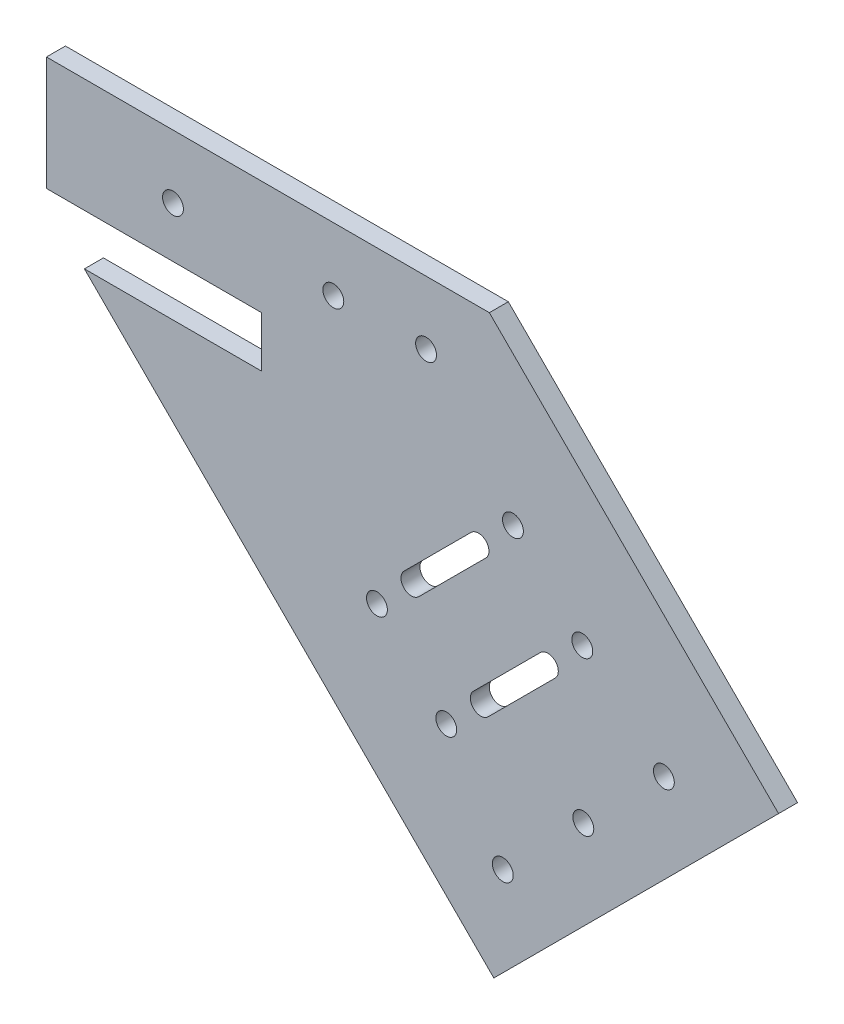
ISO-10303-21;
HEADER;
FILE_DESCRIPTION(('STEP AP214'),'2;1');
FILE_NAME('part.step','',(''),(''),'','','');
FILE_SCHEMA(('AUTOMOTIVE_DESIGN { 1 0 10303 214 1 1 1 1 }'));
ENDSEC;
DATA;
#1=APPLICATION_CONTEXT('core data for automotive mechanical design processes');
#2=APPLICATION_PROTOCOL_DEFINITION('international standard','automotive_design',2000,#1);
#3=PRODUCT_CONTEXT('',#1,'mechanical');
#4=PRODUCT('Part','Part','',(#3));
#5=PRODUCT_RELATED_PRODUCT_CATEGORY('part','',(#4));
#6=PRODUCT_DEFINITION_FORMATION('','',#4);
#7=PRODUCT_DEFINITION_CONTEXT('part definition',#1,'design');
#8=PRODUCT_DEFINITION('design','',#6,#7);
#9=PRODUCT_DEFINITION_SHAPE('','',#8);
#10=(LENGTH_UNIT() NAMED_UNIT(*) SI_UNIT(.MILLI.,.METRE.));
#11=(NAMED_UNIT(*) PLANE_ANGLE_UNIT() SI_UNIT($,.RADIAN.));
#12=(NAMED_UNIT(*) SI_UNIT($,.STERADIAN.) SOLID_ANGLE_UNIT());
#13=UNCERTAINTY_MEASURE_WITH_UNIT(LENGTH_MEASURE(1.E-05),#10,'distance_accuracy_value','');
#14=(GEOMETRIC_REPRESENTATION_CONTEXT(3) GLOBAL_UNCERTAINTY_ASSIGNED_CONTEXT((#13)) GLOBAL_UNIT_ASSIGNED_CONTEXT((#10,
#11,#12)) REPRESENTATION_CONTEXT('',''));
#15=CARTESIAN_POINT('',(0.,0.,0.));
#16=DIRECTION('',(0.,0.,1.));
#17=DIRECTION('',(1.,0.,0.));
#18=AXIS2_PLACEMENT_3D('',#15,#16,#17);
#19=CARTESIAN_POINT('',(0.,-20.,3.));
#20=DIRECTION('',(1.,0.,0.));
#21=DIRECTION('',(0.,0.,-1.));
#22=AXIS2_PLACEMENT_3D('',#19,#20,#21);
#23=PLANE('',#22);
#24=DIRECTION('',(0.,-1.,0.));
#25=VECTOR('',#24,1.);
#26=CARTESIAN_POINT('',(0.,-20.,0.));
#27=LINE('',#26,#25);
#28=CARTESIAN_POINT('',(0.,0.,0.));
#29=VERTEX_POINT('',#28);
#30=CARTESIAN_POINT('',(0.,-18.,0.));
#31=VERTEX_POINT('',#30);
#32=EDGE_CURVE('E170',#29,#31,#27,.T.);
#33=ORIENTED_EDGE('',*,*,#32,.T.);
#34=DIRECTION('',(0.,0.,1.));
#35=VECTOR('',#34,1.);
#36=CARTESIAN_POINT('',(0.,-18.,3.));
#37=LINE('',#36,#35);
#38=CARTESIAN_POINT('',(0.,-18.,3.));
#39=VERTEX_POINT('',#38);
#40=EDGE_CURVE('E217',#31,#39,#37,.T.);
#41=ORIENTED_EDGE('',*,*,#40,.T.);
#42=DIRECTION('',(0.,-1.,0.));
#43=VECTOR('',#42,1.);
#44=CARTESIAN_POINT('',(0.,-20.,3.));
#45=LINE('',#44,#43);
#46=CARTESIAN_POINT('',(0.,0.,3.));
#47=VERTEX_POINT('',#46);
#48=EDGE_CURVE('E182',#47,#39,#45,.T.);
#49=ORIENTED_EDGE('',*,*,#48,.F.);
#50=DIRECTION('',(0.,0.,-1.));
#51=VECTOR('',#50,1.);
#52=CARTESIAN_POINT('',(0.,0.,3.));
#53=LINE('',#52,#51);
#54=EDGE_CURVE('E183',#47,#29,#53,.T.);
#55=ORIENTED_EDGE('',*,*,#54,.T.);
#56=EDGE_LOOP('',(#33,#41,#49,#55));
#57=FACE_BOUND('',#56,.T.);
#58=ADVANCED_FACE('F34',(#57),#23,.F.);
#59=CARTESIAN_POINT('',(70.7106781186548,-90.7106781186547,3.));
#60=DIRECTION('',(0.707106781186547,0.707106781186548,0.));
#61=DIRECTION('',(-0.707106781186548,0.707106781186547,0.));
#62=AXIS2_PLACEMENT_3D('',#59,#60,#61);
#63=PLANE('',#62);
#64=DIRECTION('',(0.707106781186548,-0.707106781186547,0.));
#65=VECTOR('',#64,1.);
#66=CARTESIAN_POINT('',(70.7106781186548,-90.7106781186547,3.));
#67=LINE('',#66,#65);
#68=CARTESIAN_POINT('',(6.,-26.,3.));
#69=VERTEX_POINT('',#68);
#70=CARTESIAN_POINT('',(70.7106781186548,-90.7106781186547,3.));
#71=VERTEX_POINT('',#70);
#72=EDGE_CURVE('E161',#69,#71,#67,.T.);
#73=ORIENTED_EDGE('',*,*,#72,.F.);
#74=DIRECTION('',(0.,0.,-1.));
#75=VECTOR('',#74,1.);
#76=CARTESIAN_POINT('',(6.,-26.,10.));
#77=LINE('',#76,#75);
#78=CARTESIAN_POINT('',(6.,-26.,0.));
#79=VERTEX_POINT('',#78);
#80=EDGE_CURVE('E149',#69,#79,#77,.T.);
#81=ORIENTED_EDGE('',*,*,#80,.T.);
#82=DIRECTION('',(0.707106781186548,-0.707106781186547,0.));
#83=VECTOR('',#82,1.);
#84=CARTESIAN_POINT('',(70.7106781186548,-90.7106781186547,0.));
#85=LINE('',#84,#83);
#86=CARTESIAN_POINT('',(70.7106781186548,-90.7106781186547,0.));
#87=VERTEX_POINT('',#86);
#88=EDGE_CURVE('E159',#79,#87,#85,.T.);
#89=ORIENTED_EDGE('',*,*,#88,.T.);
#90=DIRECTION('',(0.,0.,-1.));
#91=VECTOR('',#90,1.);
#92=CARTESIAN_POINT('',(70.7106781186548,-90.7106781186547,3.));
#93=LINE('',#92,#91);
#94=EDGE_CURVE('E41',#71,#87,#93,.T.);
#95=ORIENTED_EDGE('',*,*,#94,.F.);
#96=EDGE_LOOP('',(#73,#81,#89,#95));
#97=FACE_BOUND('',#96,.T.);
#98=ADVANCED_FACE('F157',(#97),#63,.F.);
#99=CARTESIAN_POINT('',(115.710678118655,-45.7106781186547,3.));
#100=DIRECTION('',(-0.707106781186548,0.707106781186547,0.));
#101=DIRECTION('',(-0.707106781186547,-0.707106781186548,0.));
#102=AXIS2_PLACEMENT_3D('',#99,#100,#101);
#103=PLANE('',#102);
#104=DIRECTION('',(0.707106781186547,0.707106781186548,0.));
#105=VECTOR('',#104,1.);
#106=CARTESIAN_POINT('',(115.710678118655,-45.7106781186547,0.));
#107=LINE('',#106,#105);
#108=CARTESIAN_POINT('',(115.710678118655,-45.7106781186547,0.));
#109=VERTEX_POINT('',#108);
#110=EDGE_CURVE('E169',#87,#109,#107,.T.);
#111=ORIENTED_EDGE('',*,*,#110,.T.);
#112=DIRECTION('',(0.,0.,-1.));
#113=VECTOR('',#112,1.);
#114=CARTESIAN_POINT('',(115.710678118655,-45.7106781186547,3.));
#115=LINE('',#114,#113);
#116=CARTESIAN_POINT('',(115.710678118655,-45.7106781186547,3.));
#117=VERTEX_POINT('',#116);
#118=EDGE_CURVE('E190',#117,#109,#115,.T.);
#119=ORIENTED_EDGE('',*,*,#118,.F.);
#120=DIRECTION('',(0.707106781186547,0.707106781186548,0.));
#121=VECTOR('',#120,1.);
#122=CARTESIAN_POINT('',(115.710678118655,-45.7106781186547,3.));
#123=LINE('',#122,#121);
#124=EDGE_CURVE('E196',#71,#117,#123,.T.);
#125=ORIENTED_EDGE('',*,*,#124,.F.);
#126=ORIENTED_EDGE('',*,*,#94,.T.);
#127=EDGE_LOOP('',(#111,#119,#125,#126));
#128=FACE_BOUND('',#127,.T.);
#129=ADVANCED_FACE('F194',(#128),#103,.F.);
#130=CARTESIAN_POINT('',(70.,0.,3.));
#131=DIRECTION('',(-0.707106781186547,-0.707106781186548,0.));
#132=DIRECTION('',(0.707106781186548,-0.707106781186547,0.));
#133=AXIS2_PLACEMENT_3D('',#130,#131,#132);
#134=PLANE('',#133);
#135=DIRECTION('',(-0.707106781186548,0.707106781186547,0.));
#136=VECTOR('',#135,1.);
#137=CARTESIAN_POINT('',(70.,0.,0.));
#138=LINE('',#137,#136);
#139=CARTESIAN_POINT('',(70.,0.,0.));
#140=VERTEX_POINT('',#139);
#141=EDGE_CURVE('E172',#109,#140,#138,.T.);
#142=ORIENTED_EDGE('',*,*,#141,.T.);
#143=DIRECTION('',(0.,0.,-1.));
#144=VECTOR('',#143,1.);
#145=CARTESIAN_POINT('',(70.,0.,3.));
#146=LINE('',#145,#144);
#147=CARTESIAN_POINT('',(70.,0.,3.));
#148=VERTEX_POINT('',#147);
#149=EDGE_CURVE('E186',#148,#140,#146,.T.);
#150=ORIENTED_EDGE('',*,*,#149,.F.);
#151=DIRECTION('',(-0.707106781186548,0.707106781186547,0.));
#152=VECTOR('',#151,1.);
#153=CARTESIAN_POINT('',(70.,0.,3.));
#154=LINE('',#153,#152);
#155=EDGE_CURVE('E199',#117,#148,#154,.T.);
#156=ORIENTED_EDGE('',*,*,#155,.F.);
#157=ORIENTED_EDGE('',*,*,#118,.T.);
#158=EDGE_LOOP('',(#142,#150,#156,#157));
#159=FACE_BOUND('',#158,.T.);
#160=ADVANCED_FACE('F355',(#159),#134,.F.);
#161=CARTESIAN_POINT('',(0.,0.,3.));
#162=DIRECTION('',(0.,-1.,0.));
#163=DIRECTION('',(0.,0.,-1.));
#164=AXIS2_PLACEMENT_3D('',#161,#162,#163);
#165=PLANE('',#164);
#166=DIRECTION('',(-1.,0.,0.));
#167=VECTOR('',#166,1.);
#168=CARTESIAN_POINT('',(0.,0.,0.));
#169=LINE('',#168,#167);
#170=EDGE_CURVE('E180',#140,#29,#169,.T.);
#171=ORIENTED_EDGE('',*,*,#170,.T.);
#172=ORIENTED_EDGE('',*,*,#54,.F.);
#173=DIRECTION('',(-1.,0.,0.));
#174=VECTOR('',#173,1.);
#175=CARTESIAN_POINT('',(0.,0.,3.));
#176=LINE('',#175,#174);
#177=EDGE_CURVE('E187',#148,#47,#176,.T.);
#178=ORIENTED_EDGE('',*,*,#177,.F.);
#179=ORIENTED_EDGE('',*,*,#149,.T.);
#180=EDGE_LOOP('',(#171,#172,#178,#179));
#181=FACE_BOUND('',#180,.T.);
#182=ADVANCED_FACE('F212',(#181),#165,.F.);
#183=CARTESIAN_POINT('',(0.,0.,3.));
#184=DIRECTION('',(0.,0.,-1.));
#185=DIRECTION('',(-1.,0.,0.));
#186=AXIS2_PLACEMENT_3D('',#183,#184,#185);
#187=PLANE('',#186);
#188=CARTESIAN_POINT('',(72.1248916810278,-75.1543289325507,3.));
#189=DIRECTION('',(0.,0.,1.));
#190=DIRECTION('',(1.,0.,0.));
#191=AXIS2_PLACEMENT_3D('',#188,#189,#190);
#192=CIRCLE('',#191,1.65);
#193=CARTESIAN_POINT('',(73.7748916810278,-75.1543289325507,3.));
#194=VERTEX_POINT('',#193);
#195=EDGE_CURVE('E232',#194,#194,#192,.T.);
#196=ORIENTED_EDGE('',*,*,#195,.F.);
#197=EDGE_LOOP('',(#196));
#198=FACE_BOUND('',#197,.T.);
#199=CARTESIAN_POINT('',(84.6900414053569,-38.1939952572858,3.));
#200=DIRECTION('',(0.,0.,1.));
#201=DIRECTION('',(-1.,0.,0.));
#202=AXIS2_PLACEMENT_3D('',#199,#200,#201);
#203=CIRCLE('',#202,1.65000000000002);
#204=CARTESIAN_POINT('',(83.0400414053569,-38.1939952572858,3.));
#205=VERTEX_POINT('',#204);
#206=EDGE_CURVE('E326',#205,#205,#203,.T.);
#207=ORIENTED_EDGE('',*,*,#206,.F.);
#208=EDGE_LOOP('',(#207));
#209=FACE_BOUND('',#208,.T.);
#210=CARTESIAN_POINT('',(63.1939952572858,-59.6900414053568,3.));
#211=DIRECTION('',(0.,0.,1.));
#212=DIRECTION('',(-1.,0.,0.));
#213=AXIS2_PLACEMENT_3D('',#210,#211,#212);
#214=CIRCLE('',#213,1.64999999999999);
#215=CARTESIAN_POINT('',(61.5439952572858,-59.6900414053568,3.));
#216=VERTEX_POINT('',#215);
#217=EDGE_CURVE('E319',#216,#216,#214,.T.);
#218=ORIENTED_EDGE('',*,*,#217,.F.);
#219=EDGE_LOOP('',(#218));
#220=FACE_BOUND('',#219,.T.);
#221=CARTESIAN_POINT('',(84.8528137423857,-62.4264068711929,3.));
#222=DIRECTION('',(0.,0.,1.));
#223=DIRECTION('',(1.,0.,0.));
#224=AXIS2_PLACEMENT_3D('',#221,#222,#223);
#225=CIRCLE('',#224,1.65);
#226=CARTESIAN_POINT('',(86.5028137423857,-62.4264068711929,3.));
#227=VERTEX_POINT('',#226);
#228=EDGE_CURVE('E331',#227,#227,#225,.T.);
#229=ORIENTED_EDGE('',*,*,#228,.F.);
#230=EDGE_LOOP('',(#229));
#231=FACE_BOUND('',#230,.T.);
#232=CARTESIAN_POINT('',(60.,-10.,3.));
#233=DIRECTION('',(0.,0.,1.));
#234=DIRECTION('',(1.,0.,0.));
#235=AXIS2_PLACEMENT_3D('',#232,#233,#234);
#236=CIRCLE('',#235,1.65);
#237=CARTESIAN_POINT('',(61.65,-10.,3.));
#238=VERTEX_POINT('',#237);
#239=EDGE_CURVE('E233',#238,#238,#236,.T.);
#240=ORIENTED_EDGE('',*,*,#239,.F.);
#241=EDGE_LOOP('',(#240));
#242=FACE_BOUND('',#241,.T.);
#243=CARTESIAN_POINT('',(45.34,-10.,3.));
#244=DIRECTION('',(0.,0.,1.));
#245=DIRECTION('',(1.,0.,0.));
#246=AXIS2_PLACEMENT_3D('',#243,#244,#245);
#247=CIRCLE('',#246,1.65);
#248=CARTESIAN_POINT('',(46.99,-10.,3.));
#249=VERTEX_POINT('',#248);
#250=EDGE_CURVE('E240',#249,#249,#247,.T.);
#251=ORIENTED_EDGE('',*,*,#250,.F.);
#252=EDGE_LOOP('',(#251));
#253=FACE_BOUND('',#252,.T.);
#254=CARTESIAN_POINT('',(20.,-10.,3.));
#255=DIRECTION('',(0.,0.,1.));
#256=DIRECTION('',(1.,0.,0.));
#257=AXIS2_PLACEMENT_3D('',#254,#255,#256);
#258=CIRCLE('',#257,1.65);
#259=CARTESIAN_POINT('',(21.65,-10.,3.));
#260=VERTEX_POINT('',#259);
#261=EDGE_CURVE('E219',#260,#260,#258,.T.);
#262=ORIENTED_EDGE('',*,*,#261,.F.);
#263=EDGE_LOOP('',(#262));
#264=FACE_BOUND('',#263,.T.);
#265=CARTESIAN_POINT('',(97.5807358037436,-49.698484809835,3.));
#266=DIRECTION('',(0.,0.,1.));
#267=DIRECTION('',(1.,0.,0.));
#268=AXIS2_PLACEMENT_3D('',#265,#266,#267);
#269=CIRCLE('',#268,1.65);
#270=CARTESIAN_POINT('',(99.2307358037435,-49.698484809835,3.));
#271=VERTEX_POINT('',#270);
#272=EDGE_CURVE('E226',#271,#271,#269,.T.);
#273=ORIENTED_EDGE('',*,*,#272,.F.);
#274=EDGE_LOOP('',(#273));
#275=FACE_BOUND('',#274,.T.);
#276=DIRECTION('',(0.707106781186547,0.707106781186548,0.));
#277=VECTOR('',#276,1.);
#278=CARTESIAN_POINT('',(69.80544366138,-55.4120453791782,3.));
#279=LINE('',#278,#277);
#280=CARTESIAN_POINT('',(69.80544366138,-55.4120453791782,3.));
#281=VERTEX_POINT('',#280);
#282=CARTESIAN_POINT('',(80.4120453791783,-44.80544366138,3.));
#283=VERTEX_POINT('',#282);
#284=EDGE_CURVE('E300',#281,#283,#279,.T.);
#285=ORIENTED_EDGE('',*,*,#284,.F.);
#286=CARTESIAN_POINT('',(68.6387174724222,-54.2453191902204,3.));
#287=DIRECTION('',(0.,0.,1.));
#288=DIRECTION('',(-1.,0.,0.));
#289=AXIS2_PLACEMENT_3D('',#286,#287,#288);
#290=CIRCLE('',#289,1.64999999999998);
#291=CARTESIAN_POINT('',(67.4719912834645,-53.0785930012626,3.));
#292=VERTEX_POINT('',#291);
#293=EDGE_CURVE('E56',#292,#281,#290,.T.);
#294=ORIENTED_EDGE('',*,*,#293,.F.);
#295=DIRECTION('',(-0.707106781186548,-0.707106781186547,0.));
#296=VECTOR('',#295,1.);
#297=CARTESIAN_POINT('',(67.4719912834645,-53.0785930012626,3.));
#298=LINE('',#297,#296);
#299=CARTESIAN_POINT('',(78.0785930012627,-42.4719912834644,3.));
#300=VERTEX_POINT('',#299);
#301=EDGE_CURVE('E293',#300,#292,#298,.T.);
#302=ORIENTED_EDGE('',*,*,#301,.F.);
#303=CARTESIAN_POINT('',(79.2453191902204,-43.6387174724222,3.));
#304=DIRECTION('',(0.,0.,1.));
#305=DIRECTION('',(-1.,0.,0.));
#306=AXIS2_PLACEMENT_3D('',#303,#304,#305);
#307=CIRCLE('',#306,1.64999999999997);
#308=EDGE_CURVE('E297',#283,#300,#307,.T.);
#309=ORIENTED_EDGE('',*,*,#308,.F.);
#310=EDGE_LOOP('',(#285,#294,#302,#309));
#311=FACE_BOUND('',#310,.T.);
#312=CARTESIAN_POINT('',(52.2338401488944,-48.7298862969654,3.));
#313=DIRECTION('',(0.,0.,1.));
#314=DIRECTION('',(1.,0.,0.));
#315=AXIS2_PLACEMENT_3D('',#312,#313,#314);
#316=CIRCLE('',#315,1.65);
#317=CARTESIAN_POINT('',(53.8838401488944,-48.7298862969654,3.));
#318=VERTEX_POINT('',#317);
#319=EDGE_CURVE('E292',#318,#318,#316,.T.);
#320=ORIENTED_EDGE('',*,*,#319,.F.);
#321=EDGE_LOOP('',(#320));
#322=FACE_BOUND('',#321,.T.);
#323=CARTESIAN_POINT('',(73.7298862969654,-27.2338401488943,3.));
#324=DIRECTION('',(0.,0.,1.));
#325=DIRECTION('',(1.,0.,0.));
#326=AXIS2_PLACEMENT_3D('',#323,#324,#325);
#327=CIRCLE('',#326,1.65);
#328=CARTESIAN_POINT('',(75.3798862969654,-27.2338401488943,3.));
#329=VERTEX_POINT('',#328);
#330=EDGE_CURVE('E245',#329,#329,#327,.T.);
#331=ORIENTED_EDGE('',*,*,#330,.F.);
#332=EDGE_LOOP('',(#331));
#333=FACE_BOUND('',#332,.T.);
#334=DIRECTION('',(0.707106781186546,0.707106781186549,0.));
#335=VECTOR('',#334,1.);
#336=CARTESIAN_POINT('',(58.8452885529886,-44.4518902707867,3.));
#337=LINE('',#336,#335);
#338=CARTESIAN_POINT('',(58.8452885529886,-44.4518902707867,3.));
#339=VERTEX_POINT('',#338);
#340=CARTESIAN_POINT('',(69.4518902707868,-33.8452885529885,3.));
#341=VERTEX_POINT('',#340);
#342=EDGE_CURVE('E269',#339,#341,#337,.T.);
#343=ORIENTED_EDGE('',*,*,#342,.F.);
#344=CARTESIAN_POINT('',(57.6785623640308,-43.2851640818289,3.));
#345=DIRECTION('',(0.,0.,1.));
#346=DIRECTION('',(1.,0.,0.));
#347=AXIS2_PLACEMENT_3D('',#344,#345,#346);
#348=CIRCLE('',#347,1.64999999999998);
#349=CARTESIAN_POINT('',(56.511836175073,-42.1184378928711,3.));
#350=VERTEX_POINT('',#349);
#351=EDGE_CURVE('E252',#350,#339,#348,.T.);
#352=ORIENTED_EDGE('',*,*,#351,.F.);
#353=DIRECTION('',(-0.707106781186547,-0.707106781186548,0.));
#354=VECTOR('',#353,1.);
#355=CARTESIAN_POINT('',(56.511836175073,-42.1184378928711,3.));
#356=LINE('',#355,#354);
#357=CARTESIAN_POINT('',(67.1184378928712,-31.5118361750729,3.));
#358=VERTEX_POINT('',#357);
#359=EDGE_CURVE('E262',#358,#350,#356,.T.);
#360=ORIENTED_EDGE('',*,*,#359,.F.);
#361=CARTESIAN_POINT('',(68.285164081829,-32.6785623640307,3.));
#362=DIRECTION('',(0.,0.,1.));
#363=DIRECTION('',(1.,0.,0.));
#364=AXIS2_PLACEMENT_3D('',#361,#362,#363);
#365=CIRCLE('',#364,1.64999999999997);
#366=EDGE_CURVE('E266',#341,#358,#365,.T.);
#367=ORIENTED_EDGE('',*,*,#366,.F.);
#368=EDGE_LOOP('',(#343,#352,#360,#367));
#369=FACE_BOUND('',#368,.T.);
#370=ORIENTED_EDGE('',*,*,#48,.T.);
#371=DIRECTION('',(1.,0.,0.));
#372=VECTOR('',#371,1.);
#373=CARTESIAN_POINT('',(0.,-18.,3.));
#374=LINE('',#373,#372);
#375=CARTESIAN_POINT('',(34.,-18.,3.));
#376=VERTEX_POINT('',#375);
#377=EDGE_CURVE('E344',#39,#376,#374,.T.);
#378=ORIENTED_EDGE('',*,*,#377,.T.);
#379=DIRECTION('',(0.,-1.,0.));
#380=VECTOR('',#379,1.);
#381=CARTESIAN_POINT('',(34.,0.,3.));
#382=LINE('',#381,#380);
#383=CARTESIAN_POINT('',(34.,-26.,3.));
#384=VERTEX_POINT('',#383);
#385=EDGE_CURVE('E334',#376,#384,#382,.T.);
#386=ORIENTED_EDGE('',*,*,#385,.T.);
#387=DIRECTION('',(-1.,0.,0.));
#388=VECTOR('',#387,1.);
#389=CARTESIAN_POINT('',(0.,-26.,3.));
#390=LINE('',#389,#388);
#391=EDGE_CURVE('E346',#384,#69,#390,.T.);
#392=ORIENTED_EDGE('',*,*,#391,.T.);
#393=ORIENTED_EDGE('',*,*,#72,.T.);
#394=ORIENTED_EDGE('',*,*,#124,.T.);
#395=ORIENTED_EDGE('',*,*,#155,.T.);
#396=ORIENTED_EDGE('',*,*,#177,.T.);
#397=EDGE_LOOP('',(#370,#378,#386,#392,#393,#394,#395,#396));
#398=FACE_BOUND('',#397,.T.);
#399=ADVANCED_FACE('F207',(#198,#209,#220,#231,#242,#253,#264,#275,#311,#322,#333,#369,#398),
#187,.F.);
#400=CARTESIAN_POINT('',(0.,0.,0.));
#401=DIRECTION('',(0.,0.,-1.));
#402=DIRECTION('',(-1.,0.,0.));
#403=AXIS2_PLACEMENT_3D('',#400,#401,#402);
#404=PLANE('',#403);
#405=DIRECTION('',(1.,0.,0.));
#406=VECTOR('',#405,1.);
#407=CARTESIAN_POINT('',(0.,-18.,0.));
#408=LINE('',#407,#406);
#409=CARTESIAN_POINT('',(34.,-18.,0.));
#410=VERTEX_POINT('',#409);
#411=EDGE_CURVE('E11',#31,#410,#408,.T.);
#412=ORIENTED_EDGE('',*,*,#411,.F.);
#413=ORIENTED_EDGE('',*,*,#32,.F.);
#414=ORIENTED_EDGE('',*,*,#170,.F.);
#415=ORIENTED_EDGE('',*,*,#141,.F.);
#416=ORIENTED_EDGE('',*,*,#110,.F.);
#417=ORIENTED_EDGE('',*,*,#88,.F.);
#418=DIRECTION('',(-1.,0.,0.));
#419=VECTOR('',#418,1.);
#420=CARTESIAN_POINT('',(34.,-26.,0.));
#421=LINE('',#420,#419);
#422=CARTESIAN_POINT('',(34.,-26.,0.));
#423=VERTEX_POINT('',#422);
#424=EDGE_CURVE('E146',#423,#79,#421,.T.);
#425=ORIENTED_EDGE('',*,*,#424,.F.);
#426=DIRECTION('',(0.,-1.,0.));
#427=VECTOR('',#426,1.);
#428=CARTESIAN_POINT('',(34.,-18.,0.));
#429=LINE('',#428,#427);
#430=EDGE_CURVE('E48',#410,#423,#429,.T.);
#431=ORIENTED_EDGE('',*,*,#430,.F.);
#432=EDGE_LOOP('',(#412,#413,#414,#415,#416,#417,#425,#431));
#433=FACE_BOUND('',#432,.T.);
#434=CARTESIAN_POINT('',(72.1248916810278,-75.1543289325507,0.));
#435=DIRECTION('',(0.,0.,1.));
#436=DIRECTION('',(1.,0.,0.));
#437=AXIS2_PLACEMENT_3D('',#434,#435,#436);
#438=CIRCLE('',#437,1.65);
#439=CARTESIAN_POINT('',(73.7748916810278,-75.1543289325507,0.));
#440=VERTEX_POINT('',#439);
#441=EDGE_CURVE('E175',#440,#440,#438,.T.);
#442=ORIENTED_EDGE('',*,*,#441,.T.);
#443=EDGE_LOOP('',(#442));
#444=FACE_BOUND('',#443,.T.);
#445=CARTESIAN_POINT('',(84.6900414053569,-38.1939952572858,0.));
#446=DIRECTION('',(0.,0.,1.));
#447=DIRECTION('',(-1.,0.,0.));
#448=AXIS2_PLACEMENT_3D('',#445,#446,#447);
#449=CIRCLE('',#448,1.65000000000002);
#450=CARTESIAN_POINT('',(83.0400414053569,-38.1939952572858,0.));
#451=VERTEX_POINT('',#450);
#452=EDGE_CURVE('E304',#451,#451,#449,.T.);
#453=ORIENTED_EDGE('',*,*,#452,.T.);
#454=EDGE_LOOP('',(#453));
#455=FACE_BOUND('',#454,.T.);
#456=CARTESIAN_POINT('',(63.1939952572858,-59.6900414053568,0.));
#457=DIRECTION('',(0.,0.,1.));
#458=DIRECTION('',(-1.,0.,0.));
#459=AXIS2_PLACEMENT_3D('',#456,#457,#458);
#460=CIRCLE('',#459,1.64999999999999);
#461=CARTESIAN_POINT('',(61.5439952572858,-59.6900414053568,0.));
#462=VERTEX_POINT('',#461);
#463=EDGE_CURVE('E322',#462,#462,#460,.T.);
#464=ORIENTED_EDGE('',*,*,#463,.T.);
#465=EDGE_LOOP('',(#464));
#466=FACE_BOUND('',#465,.T.);
#467=CARTESIAN_POINT('',(84.8528137423857,-62.4264068711929,0.));
#468=DIRECTION('',(0.,0.,1.));
#469=DIRECTION('',(1.,0.,0.));
#470=AXIS2_PLACEMENT_3D('',#467,#468,#469);
#471=CIRCLE('',#470,1.65);
#472=CARTESIAN_POINT('',(86.5028137423857,-62.4264068711929,0.));
#473=VERTEX_POINT('',#472);
#474=EDGE_CURVE('E323',#473,#473,#471,.T.);
#475=ORIENTED_EDGE('',*,*,#474,.T.);
#476=EDGE_LOOP('',(#475));
#477=FACE_BOUND('',#476,.T.);
#478=CARTESIAN_POINT('',(60.,-10.,0.));
#479=DIRECTION('',(0.,0.,1.));
#480=DIRECTION('',(1.,0.,0.));
#481=AXIS2_PLACEMENT_3D('',#478,#479,#480);
#482=CIRCLE('',#481,1.65);
#483=CARTESIAN_POINT('',(61.65,-10.,0.));
#484=VERTEX_POINT('',#483);
#485=EDGE_CURVE('E236',#484,#484,#482,.T.);
#486=ORIENTED_EDGE('',*,*,#485,.T.);
#487=EDGE_LOOP('',(#486));
#488=FACE_BOUND('',#487,.T.);
#489=CARTESIAN_POINT('',(45.34,-10.,0.));
#490=DIRECTION('',(0.,0.,1.));
#491=DIRECTION('',(1.,0.,0.));
#492=AXIS2_PLACEMENT_3D('',#489,#490,#491);
#493=CIRCLE('',#492,1.65);
#494=CARTESIAN_POINT('',(46.99,-10.,0.));
#495=VERTEX_POINT('',#494);
#496=EDGE_CURVE('E223',#495,#495,#493,.T.);
#497=ORIENTED_EDGE('',*,*,#496,.T.);
#498=EDGE_LOOP('',(#497));
#499=FACE_BOUND('',#498,.T.);
#500=CARTESIAN_POINT('',(20.,-10.,0.));
#501=DIRECTION('',(0.,0.,1.));
#502=DIRECTION('',(1.,0.,0.));
#503=AXIS2_PLACEMENT_3D('',#500,#501,#502);
#504=CIRCLE('',#503,1.65);
#505=CARTESIAN_POINT('',(21.65,-10.,0.));
#506=VERTEX_POINT('',#505);
#507=EDGE_CURVE('E222',#506,#506,#504,.T.);
#508=ORIENTED_EDGE('',*,*,#507,.T.);
#509=EDGE_LOOP('',(#508));
#510=FACE_BOUND('',#509,.T.);
#511=CARTESIAN_POINT('',(97.5807358037436,-49.698484809835,0.));
#512=DIRECTION('',(0.,0.,1.));
#513=DIRECTION('',(1.,0.,0.));
#514=AXIS2_PLACEMENT_3D('',#511,#512,#513);
#515=CIRCLE('',#514,1.65);
#516=CARTESIAN_POINT('',(99.2307358037435,-49.698484809835,0.));
#517=VERTEX_POINT('',#516);
#518=EDGE_CURVE('E229',#517,#517,#515,.T.);
#519=ORIENTED_EDGE('',*,*,#518,.T.);
#520=EDGE_LOOP('',(#519));
#521=FACE_BOUND('',#520,.T.);
#522=CARTESIAN_POINT('',(68.6387174724222,-54.2453191902204,0.));
#523=DIRECTION('',(0.,0.,1.));
#524=DIRECTION('',(-1.,0.,0.));
#525=AXIS2_PLACEMENT_3D('',#522,#523,#524);
#526=CIRCLE('',#525,1.64999999999998);
#527=CARTESIAN_POINT('',(67.4719912834645,-53.0785930012626,0.));
#528=VERTEX_POINT('',#527);
#529=CARTESIAN_POINT('',(69.80544366138,-55.4120453791782,0.));
#530=VERTEX_POINT('',#529);
#531=EDGE_CURVE('E296',#528,#530,#526,.T.);
#532=ORIENTED_EDGE('',*,*,#531,.T.);
#533=DIRECTION('',(0.707106781186547,0.707106781186548,0.));
#534=VECTOR('',#533,1.);
#535=CARTESIAN_POINT('',(69.80544366138,-55.4120453791782,0.));
#536=LINE('',#535,#534);
#537=CARTESIAN_POINT('',(80.4120453791782,-44.80544366138,0.));
#538=VERTEX_POINT('',#537);
#539=EDGE_CURVE('E310',#530,#538,#536,.T.);
#540=ORIENTED_EDGE('',*,*,#539,.T.);
#541=CARTESIAN_POINT('',(79.2453191902204,-43.6387174724222,0.));
#542=DIRECTION('',(0.,0.,1.));
#543=DIRECTION('',(-1.,0.,0.));
#544=AXIS2_PLACEMENT_3D('',#541,#542,#543);
#545=CIRCLE('',#544,1.64999999999997);
#546=CARTESIAN_POINT('',(78.0785930012627,-42.4719912834644,0.));
#547=VERTEX_POINT('',#546);
#548=EDGE_CURVE('E307',#538,#547,#545,.T.);
#549=ORIENTED_EDGE('',*,*,#548,.T.);
#550=DIRECTION('',(-0.707106781186548,-0.707106781186547,0.));
#551=VECTOR('',#550,1.);
#552=CARTESIAN_POINT('',(67.4719912834645,-53.0785930012626,0.));
#553=LINE('',#552,#551);
#554=EDGE_CURVE('E286',#547,#528,#553,.T.);
#555=ORIENTED_EDGE('',*,*,#554,.T.);
#556=EDGE_LOOP('',(#532,#540,#549,#555));
#557=FACE_BOUND('',#556,.T.);
#558=CARTESIAN_POINT('',(52.2338401488944,-48.7298862969654,0.));
#559=DIRECTION('',(0.,0.,1.));
#560=DIRECTION('',(1.,0.,0.));
#561=AXIS2_PLACEMENT_3D('',#558,#559,#560);
#562=CIRCLE('',#561,1.65);
#563=CARTESIAN_POINT('',(53.8838401488944,-48.7298862969654,0.));
#564=VERTEX_POINT('',#563);
#565=EDGE_CURVE('E249',#564,#564,#562,.T.);
#566=ORIENTED_EDGE('',*,*,#565,.T.);
#567=EDGE_LOOP('',(#566));
#568=FACE_BOUND('',#567,.T.);
#569=CARTESIAN_POINT('',(73.7298862969654,-27.2338401488943,0.));
#570=DIRECTION('',(0.,0.,1.));
#571=DIRECTION('',(1.,0.,0.));
#572=AXIS2_PLACEMENT_3D('',#569,#570,#571);
#573=CIRCLE('',#572,1.65);
#574=CARTESIAN_POINT('',(75.3798862969654,-27.2338401488943,0.));
#575=VERTEX_POINT('',#574);
#576=EDGE_CURVE('E248',#575,#575,#573,.T.);
#577=ORIENTED_EDGE('',*,*,#576,.T.);
#578=EDGE_LOOP('',(#577));
#579=FACE_BOUND('',#578,.T.);
#580=CARTESIAN_POINT('',(57.6785623640308,-43.2851640818289,0.));
#581=DIRECTION('',(0.,0.,1.));
#582=DIRECTION('',(1.,0.,0.));
#583=AXIS2_PLACEMENT_3D('',#580,#581,#582);
#584=CIRCLE('',#583,1.64999999999998);
#585=CARTESIAN_POINT('',(56.511836175073,-42.1184378928711,0.));
#586=VERTEX_POINT('',#585);
#587=CARTESIAN_POINT('',(58.8452885529886,-44.4518902707867,0.));
#588=VERTEX_POINT('',#587);
#589=EDGE_CURVE('E265',#586,#588,#584,.T.);
#590=ORIENTED_EDGE('',*,*,#589,.T.);
#591=DIRECTION('',(0.707106781186546,0.707106781186549,0.));
#592=VECTOR('',#591,1.);
#593=CARTESIAN_POINT('',(58.8452885529886,-44.4518902707867,0.));
#594=LINE('',#593,#592);
#595=CARTESIAN_POINT('',(69.4518902707867,-33.8452885529885,0.));
#596=VERTEX_POINT('',#595);
#597=EDGE_CURVE('E278',#588,#596,#594,.T.);
#598=ORIENTED_EDGE('',*,*,#597,.T.);
#599=CARTESIAN_POINT('',(68.285164081829,-32.6785623640307,0.));
#600=DIRECTION('',(0.,0.,1.));
#601=DIRECTION('',(1.,0.,0.));
#602=AXIS2_PLACEMENT_3D('',#599,#600,#601);
#603=CIRCLE('',#602,1.64999999999997);
#604=CARTESIAN_POINT('',(67.1184378928712,-31.5118361750729,0.));
#605=VERTEX_POINT('',#604);
#606=EDGE_CURVE('E275',#596,#605,#603,.T.);
#607=ORIENTED_EDGE('',*,*,#606,.T.);
#608=DIRECTION('',(-0.707106781186547,-0.707106781186548,0.));
#609=VECTOR('',#608,1.);
#610=CARTESIAN_POINT('',(56.511836175073,-42.1184378928711,0.));
#611=LINE('',#610,#609);
#612=EDGE_CURVE('E257',#605,#586,#611,.T.);
#613=ORIENTED_EDGE('',*,*,#612,.T.);
#614=EDGE_LOOP('',(#590,#598,#607,#613));
#615=FACE_BOUND('',#614,.T.);
#616=ADVANCED_FACE('F166',(#433,#444,#455,#466,#477,#488,#499,#510,#521,#557,#568,#579,#615),
#404,.T.);
#617=CARTESIAN_POINT('',(57.6785623640308,-43.2851640818289,0.));
#618=DIRECTION('',(0.,0.,1.));
#619=DIRECTION('',(1.,0.,0.));
#620=AXIS2_PLACEMENT_3D('',#617,#618,#619);
#621=CYLINDRICAL_SURFACE('',#620,1.64999999999998);
#622=ORIENTED_EDGE('',*,*,#351,.T.);
#623=DIRECTION('',(0.,0.,1.));
#624=VECTOR('',#623,1.);
#625=CARTESIAN_POINT('',(58.8452885529886,-44.4518902707867,0.));
#626=LINE('',#625,#624);
#627=EDGE_CURVE('E253',#588,#339,#626,.T.);
#628=ORIENTED_EDGE('',*,*,#627,.F.);
#629=ORIENTED_EDGE('',*,*,#589,.F.);
#630=DIRECTION('',(0.,0.,1.));
#631=VECTOR('',#630,1.);
#632=CARTESIAN_POINT('',(56.511836175073,-42.1184378928711,0.));
#633=LINE('',#632,#631);
#634=EDGE_CURVE('E237',#586,#350,#633,.T.);
#635=ORIENTED_EDGE('',*,*,#634,.T.);
#636=EDGE_LOOP('',(#622,#628,#629,#635));
#637=FACE_BOUND('',#636,.T.);
#638=ADVANCED_FACE('F392',(#637),#621,.F.);
#639=CARTESIAN_POINT('',(56.511836175073,-42.1184378928711,0.));
#640=DIRECTION('',(-0.707106781186548,0.707106781186547,0.));
#641=DIRECTION('',(-0.707106781186547,-0.707106781186548,0.));
#642=AXIS2_PLACEMENT_3D('',#639,#640,#641);
#643=PLANE('',#642);
#644=ORIENTED_EDGE('',*,*,#359,.T.);
#645=ORIENTED_EDGE('',*,*,#634,.F.);
#646=ORIENTED_EDGE('',*,*,#612,.F.);
#647=DIRECTION('',(0.,0.,1.));
#648=VECTOR('',#647,1.);
#649=CARTESIAN_POINT('',(67.1184378928712,-31.5118361750729,0.));
#650=LINE('',#649,#648);
#651=EDGE_CURVE('E259',#605,#358,#650,.T.);
#652=ORIENTED_EDGE('',*,*,#651,.T.);
#653=EDGE_LOOP('',(#644,#645,#646,#652));
#654=FACE_BOUND('',#653,.T.);
#655=ADVANCED_FACE('F397',(#654),#643,.F.);
#656=CARTESIAN_POINT('',(68.285164081829,-32.6785623640307,0.));
#657=DIRECTION('',(0.,0.,1.));
#658=DIRECTION('',(1.,0.,0.));
#659=AXIS2_PLACEMENT_3D('',#656,#657,#658);
#660=CYLINDRICAL_SURFACE('',#659,1.64999999999997);
#661=ORIENTED_EDGE('',*,*,#366,.T.);
#662=ORIENTED_EDGE('',*,*,#651,.F.);
#663=ORIENTED_EDGE('',*,*,#606,.F.);
#664=DIRECTION('',(0.,0.,1.));
#665=VECTOR('',#664,1.);
#666=CARTESIAN_POINT('',(69.4518902707868,-33.8452885529885,0.));
#667=LINE('',#666,#665);
#668=EDGE_CURVE('E256',#596,#341,#667,.T.);
#669=ORIENTED_EDGE('',*,*,#668,.T.);
#670=EDGE_LOOP('',(#661,#662,#663,#669));
#671=FACE_BOUND('',#670,.T.);
#672=ADVANCED_FACE('F409',(#671),#660,.F.);
#673=CARTESIAN_POINT('',(58.8452885529886,-44.4518902707867,0.));
#674=DIRECTION('',(0.707106781186549,-0.707106781186546,0.));
#675=DIRECTION('',(0.707106781186546,0.707106781186549,0.));
#676=AXIS2_PLACEMENT_3D('',#673,#674,#675);
#677=PLANE('',#676);
#678=ORIENTED_EDGE('',*,*,#342,.T.);
#679=ORIENTED_EDGE('',*,*,#668,.F.);
#680=ORIENTED_EDGE('',*,*,#597,.F.);
#681=ORIENTED_EDGE('',*,*,#627,.T.);
#682=EDGE_LOOP('',(#678,#679,#680,#681));
#683=FACE_BOUND('',#682,.T.);
#684=ADVANCED_FACE('F419',(#683),#677,.F.);
#685=CARTESIAN_POINT('',(73.7298862969654,-27.2338401488943,0.));
#686=DIRECTION('',(0.,0.,1.));
#687=DIRECTION('',(1.,0.,0.));
#688=AXIS2_PLACEMENT_3D('',#685,#686,#687);
#689=CYLINDRICAL_SURFACE('',#688,1.65);
#690=ORIENTED_EDGE('',*,*,#576,.F.);
#691=EDGE_LOOP('',(#690));
#692=FACE_BOUND('',#691,.T.);
#693=ORIENTED_EDGE('',*,*,#330,.T.);
#694=EDGE_LOOP('',(#693));
#695=FACE_BOUND('',#694,.T.);
#696=ADVANCED_FACE('F429',(#692,#695),#689,.F.);
#697=CARTESIAN_POINT('',(52.2338401488944,-48.7298862969654,0.));
#698=DIRECTION('',(0.,0.,1.));
#699=DIRECTION('',(1.,0.,0.));
#700=AXIS2_PLACEMENT_3D('',#697,#698,#699);
#701=CYLINDRICAL_SURFACE('',#700,1.65);
#702=ORIENTED_EDGE('',*,*,#565,.F.);
#703=EDGE_LOOP('',(#702));
#704=FACE_BOUND('',#703,.T.);
#705=ORIENTED_EDGE('',*,*,#319,.T.);
#706=EDGE_LOOP('',(#705));
#707=FACE_BOUND('',#706,.T.);
#708=ADVANCED_FACE('F439',(#704,#707),#701,.F.);
#709=CARTESIAN_POINT('',(68.6387174724222,-54.2453191902204,0.));
#710=DIRECTION('',(0.,0.,1.));
#711=DIRECTION('',(1.,0.,0.));
#712=AXIS2_PLACEMENT_3D('',#709,#710,#711);
#713=CYLINDRICAL_SURFACE('',#712,1.64999999999998);
#714=ORIENTED_EDGE('',*,*,#293,.T.);
#715=DIRECTION('',(0.,0.,1.));
#716=VECTOR('',#715,1.);
#717=CARTESIAN_POINT('',(69.80544366138,-55.4120453791782,0.));
#718=LINE('',#717,#716);
#719=EDGE_CURVE('E283',#530,#281,#718,.T.);
#720=ORIENTED_EDGE('',*,*,#719,.F.);
#721=ORIENTED_EDGE('',*,*,#531,.F.);
#722=DIRECTION('',(0.,0.,1.));
#723=VECTOR('',#722,1.);
#724=CARTESIAN_POINT('',(67.4719912834645,-53.0785930012626,0.));
#725=LINE('',#724,#723);
#726=EDGE_CURVE('E290',#528,#292,#725,.T.);
#727=ORIENTED_EDGE('',*,*,#726,.T.);
#728=EDGE_LOOP('',(#714,#720,#721,#727));
#729=FACE_BOUND('',#728,.T.);
#730=ADVANCED_FACE('F449',(#729),#713,.F.);
#731=CARTESIAN_POINT('',(67.4719912834645,-53.0785930012626,0.));
#732=DIRECTION('',(-0.707106781186547,0.707106781186548,0.));
#733=DIRECTION('',(-0.707106781186548,-0.707106781186547,0.));
#734=AXIS2_PLACEMENT_3D('',#731,#732,#733);
#735=PLANE('',#734);
#736=ORIENTED_EDGE('',*,*,#301,.T.);
#737=ORIENTED_EDGE('',*,*,#726,.F.);
#738=ORIENTED_EDGE('',*,*,#554,.F.);
#739=DIRECTION('',(0.,0.,1.));
#740=VECTOR('',#739,1.);
#741=CARTESIAN_POINT('',(78.0785930012627,-42.4719912834644,0.));
#742=LINE('',#741,#740);
#743=EDGE_CURVE('E288',#547,#300,#742,.T.);
#744=ORIENTED_EDGE('',*,*,#743,.T.);
#745=EDGE_LOOP('',(#736,#737,#738,#744));
#746=FACE_BOUND('',#745,.T.);
#747=ADVANCED_FACE('F459',(#746),#735,.F.);
#748=CARTESIAN_POINT('',(79.2453191902204,-43.6387174724222,0.));
#749=DIRECTION('',(0.,0.,1.));
#750=DIRECTION('',(1.,0.,0.));
#751=AXIS2_PLACEMENT_3D('',#748,#749,#750);
#752=CYLINDRICAL_SURFACE('',#751,1.64999999999997);
#753=ORIENTED_EDGE('',*,*,#308,.T.);
#754=ORIENTED_EDGE('',*,*,#743,.F.);
#755=ORIENTED_EDGE('',*,*,#548,.F.);
#756=DIRECTION('',(0.,0.,1.));
#757=VECTOR('',#756,1.);
#758=CARTESIAN_POINT('',(80.4120453791783,-44.80544366138,0.));
#759=LINE('',#758,#757);
#760=EDGE_CURVE('E285',#538,#283,#759,.T.);
#761=ORIENTED_EDGE('',*,*,#760,.T.);
#762=EDGE_LOOP('',(#753,#754,#755,#761));
#763=FACE_BOUND('',#762,.T.);
#764=ADVANCED_FACE('F468',(#763),#752,.F.);
#765=CARTESIAN_POINT('',(69.80544366138,-55.4120453791782,0.));
#766=DIRECTION('',(0.707106781186548,-0.707106781186547,0.));
#767=DIRECTION('',(0.707106781186547,0.707106781186548,0.));
#768=AXIS2_PLACEMENT_3D('',#765,#766,#767);
#769=PLANE('',#768);
#770=ORIENTED_EDGE('',*,*,#284,.T.);
#771=ORIENTED_EDGE('',*,*,#760,.F.);
#772=ORIENTED_EDGE('',*,*,#539,.F.);
#773=ORIENTED_EDGE('',*,*,#719,.T.);
#774=EDGE_LOOP('',(#770,#771,#772,#773));
#775=FACE_BOUND('',#774,.T.);
#776=ADVANCED_FACE('F478',(#775),#769,.F.);
#777=CARTESIAN_POINT('',(97.5807358037436,-49.698484809835,0.));
#778=DIRECTION('',(0.,0.,1.));
#779=DIRECTION('',(1.,0.,0.));
#780=AXIS2_PLACEMENT_3D('',#777,#778,#779);
#781=CYLINDRICAL_SURFACE('',#780,1.65);
#782=ORIENTED_EDGE('',*,*,#518,.F.);
#783=EDGE_LOOP('',(#782));
#784=FACE_BOUND('',#783,.T.);
#785=ORIENTED_EDGE('',*,*,#272,.T.);
#786=EDGE_LOOP('',(#785));
#787=FACE_BOUND('',#786,.T.);
#788=ADVANCED_FACE('F488',(#784,#787),#781,.F.);
#789=CARTESIAN_POINT('',(20.,-10.,0.));
#790=DIRECTION('',(0.,0.,1.));
#791=DIRECTION('',(1.,0.,0.));
#792=AXIS2_PLACEMENT_3D('',#789,#790,#791);
#793=CYLINDRICAL_SURFACE('',#792,1.65);
#794=ORIENTED_EDGE('',*,*,#507,.F.);
#795=EDGE_LOOP('',(#794));
#796=FACE_BOUND('',#795,.T.);
#797=ORIENTED_EDGE('',*,*,#261,.T.);
#798=EDGE_LOOP('',(#797));
#799=FACE_BOUND('',#798,.T.);
#800=ADVANCED_FACE('F498',(#796,#799),#793,.F.);
#801=CARTESIAN_POINT('',(45.34,-10.,0.));
#802=DIRECTION('',(0.,0.,1.));
#803=DIRECTION('',(1.,0.,0.));
#804=AXIS2_PLACEMENT_3D('',#801,#802,#803);
#805=CYLINDRICAL_SURFACE('',#804,1.65);
#806=ORIENTED_EDGE('',*,*,#496,.F.);
#807=EDGE_LOOP('',(#806));
#808=FACE_BOUND('',#807,.T.);
#809=ORIENTED_EDGE('',*,*,#250,.T.);
#810=EDGE_LOOP('',(#809));
#811=FACE_BOUND('',#810,.T.);
#812=ADVANCED_FACE('F508',(#808,#811),#805,.F.);
#813=CARTESIAN_POINT('',(60.,-10.,0.));
#814=DIRECTION('',(0.,0.,1.));
#815=DIRECTION('',(1.,0.,0.));
#816=AXIS2_PLACEMENT_3D('',#813,#814,#815);
#817=CYLINDRICAL_SURFACE('',#816,1.65);
#818=ORIENTED_EDGE('',*,*,#485,.F.);
#819=EDGE_LOOP('',(#818));
#820=FACE_BOUND('',#819,.T.);
#821=ORIENTED_EDGE('',*,*,#239,.T.);
#822=EDGE_LOOP('',(#821));
#823=FACE_BOUND('',#822,.T.);
#824=ADVANCED_FACE('F518',(#820,#823),#817,.F.);
#825=CARTESIAN_POINT('',(84.8528137423857,-62.4264068711929,0.));
#826=DIRECTION('',(0.,0.,1.));
#827=DIRECTION('',(1.,0.,0.));
#828=AXIS2_PLACEMENT_3D('',#825,#826,#827);
#829=CYLINDRICAL_SURFACE('',#828,1.65);
#830=ORIENTED_EDGE('',*,*,#474,.F.);
#831=EDGE_LOOP('',(#830));
#832=FACE_BOUND('',#831,.T.);
#833=ORIENTED_EDGE('',*,*,#228,.T.);
#834=EDGE_LOOP('',(#833));
#835=FACE_BOUND('',#834,.T.);
#836=ADVANCED_FACE('F528',(#832,#835),#829,.F.);
#837=CARTESIAN_POINT('',(63.1939952572858,-59.6900414053568,0.));
#838=DIRECTION('',(0.,0.,1.));
#839=DIRECTION('',(1.,0.,0.));
#840=AXIS2_PLACEMENT_3D('',#837,#838,#839);
#841=CYLINDRICAL_SURFACE('',#840,1.64999999999999);
#842=ORIENTED_EDGE('',*,*,#463,.F.);
#843=EDGE_LOOP('',(#842));
#844=FACE_BOUND('',#843,.T.);
#845=ORIENTED_EDGE('',*,*,#217,.T.);
#846=EDGE_LOOP('',(#845));
#847=FACE_BOUND('',#846,.T.);
#848=ADVANCED_FACE('F538',(#844,#847),#841,.F.);
#849=CARTESIAN_POINT('',(84.6900414053569,-38.1939952572858,0.));
#850=DIRECTION('',(0.,0.,1.));
#851=DIRECTION('',(1.,0.,0.));
#852=AXIS2_PLACEMENT_3D('',#849,#850,#851);
#853=CYLINDRICAL_SURFACE('',#852,1.65000000000002);
#854=ORIENTED_EDGE('',*,*,#452,.F.);
#855=EDGE_LOOP('',(#854));
#856=FACE_BOUND('',#855,.T.);
#857=ORIENTED_EDGE('',*,*,#206,.T.);
#858=EDGE_LOOP('',(#857));
#859=FACE_BOUND('',#858,.T.);
#860=ADVANCED_FACE('F548',(#856,#859),#853,.F.);
#861=CARTESIAN_POINT('',(72.1248916810278,-75.1543289325507,0.));
#862=DIRECTION('',(0.,0.,1.));
#863=DIRECTION('',(1.,0.,0.));
#864=AXIS2_PLACEMENT_3D('',#861,#862,#863);
#865=CYLINDRICAL_SURFACE('',#864,1.65);
#866=ORIENTED_EDGE('',*,*,#441,.F.);
#867=EDGE_LOOP('',(#866));
#868=FACE_BOUND('',#867,.T.);
#869=ORIENTED_EDGE('',*,*,#195,.T.);
#870=EDGE_LOOP('',(#869));
#871=FACE_BOUND('',#870,.T.);
#872=ADVANCED_FACE('F558',(#868,#871),#865,.F.);
#873=CARTESIAN_POINT('',(34.,-18.,10.));
#874=DIRECTION('',(1.,0.,0.));
#875=DIRECTION('',(0.,0.,-1.));
#876=AXIS2_PLACEMENT_3D('',#873,#874,#875);
#877=PLANE('',#876);
#878=DIRECTION('',(0.,0.,-1.));
#879=VECTOR('',#878,1.);
#880=CARTESIAN_POINT('',(34.,-18.,10.));
#881=LINE('',#880,#879);
#882=EDGE_CURVE('E162',#376,#410,#881,.T.);
#883=ORIENTED_EDGE('',*,*,#882,.T.);
#884=ORIENTED_EDGE('',*,*,#430,.T.);
#885=DIRECTION('',(0.,0.,-1.));
#886=VECTOR('',#885,1.);
#887=CARTESIAN_POINT('',(34.,-26.,10.));
#888=LINE('',#887,#886);
#889=EDGE_CURVE('E151',#384,#423,#888,.T.);
#890=ORIENTED_EDGE('',*,*,#889,.F.);
#891=ORIENTED_EDGE('',*,*,#385,.F.);
#892=EDGE_LOOP('',(#883,#884,#890,#891));
#893=FACE_BOUND('',#892,.T.);
#894=ADVANCED_FACE('F351',(#893),#877,.F.);
#895=CARTESIAN_POINT('',(34.,-18.,10.));
#896=DIRECTION('',(0.,1.,0.));
#897=DIRECTION('',(-1.,0.,0.));
#898=AXIS2_PLACEMENT_3D('',#895,#896,#897);
#899=PLANE('',#898);
#900=ORIENTED_EDGE('',*,*,#411,.T.);
#901=ORIENTED_EDGE('',*,*,#882,.F.);
#902=ORIENTED_EDGE('',*,*,#377,.F.);
#903=ORIENTED_EDGE('',*,*,#40,.F.);
#904=EDGE_LOOP('',(#900,#901,#902,#903));
#905=FACE_BOUND('',#904,.T.);
#906=ADVANCED_FACE('F353',(#905),#899,.F.);
#907=CARTESIAN_POINT('',(34.,-26.,10.));
#908=DIRECTION('',(0.,-1.,0.));
#909=DIRECTION('',(1.,0.,0.));
#910=AXIS2_PLACEMENT_3D('',#907,#908,#909);
#911=PLANE('',#910);
#912=ORIENTED_EDGE('',*,*,#889,.T.);
#913=ORIENTED_EDGE('',*,*,#424,.T.);
#914=ORIENTED_EDGE('',*,*,#80,.F.);
#915=ORIENTED_EDGE('',*,*,#391,.F.);
#916=EDGE_LOOP('',(#912,#913,#914,#915));
#917=FACE_BOUND('',#916,.T.);
#918=ADVANCED_FACE('F148',(#917),#911,.F.);
#919=CLOSED_SHELL('',(#58,#98,#129,#160,#182,#399,#616,#638,#655,#672,#684,#696,#708,#730,#747,
#764,#776,#788,#800,#812,#824,#836,#848,#860,#872,#894,#906,#918));
#920=MANIFOLD_SOLID_BREP('B2',#919);
#921=ADVANCED_BREP_SHAPE_REPRESENTATION('',(#18,#920),#14);
#922=SHAPE_DEFINITION_REPRESENTATION(#9,#921);
ENDSEC;
END-ISO-10303-21;
